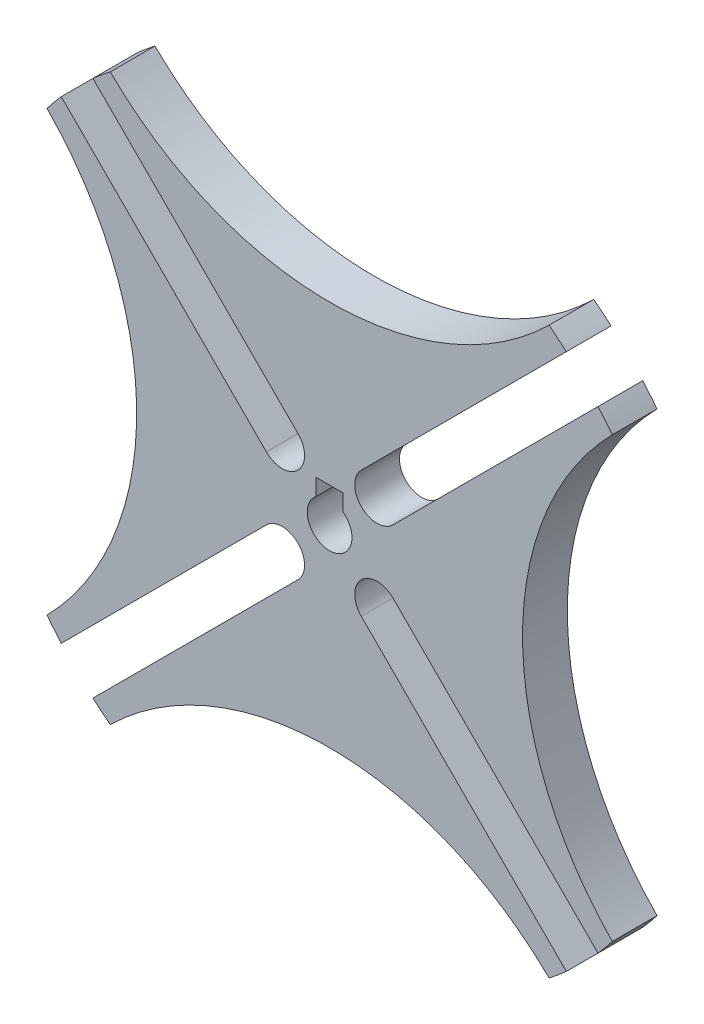
ISO-10303-21;
HEADER;
FILE_DESCRIPTION(('STEP AP214'),'2;1');
FILE_NAME('part.step','',(''),(''),'','','');
FILE_SCHEMA(('AUTOMOTIVE_DESIGN { 1 0 10303 214 1 1 1 1 }'));
ENDSEC;
DATA;
#1=APPLICATION_CONTEXT('core data for automotive mechanical design processes');
#2=APPLICATION_PROTOCOL_DEFINITION('international standard','automotive_design',2000,#1);
#3=PRODUCT_CONTEXT('',#1,'mechanical');
#4=PRODUCT('Part','Part','',(#3));
#5=PRODUCT_RELATED_PRODUCT_CATEGORY('part','',(#4));
#6=PRODUCT_DEFINITION_FORMATION('','',#4);
#7=PRODUCT_DEFINITION_CONTEXT('part definition',#1,'design');
#8=PRODUCT_DEFINITION('design','',#6,#7);
#9=PRODUCT_DEFINITION_SHAPE('','',#8);
#10=(LENGTH_UNIT() NAMED_UNIT(*) SI_UNIT(.MILLI.,.METRE.));
#11=(NAMED_UNIT(*) PLANE_ANGLE_UNIT() SI_UNIT($,.RADIAN.));
#12=(NAMED_UNIT(*) SI_UNIT($,.STERADIAN.) SOLID_ANGLE_UNIT());
#13=UNCERTAINTY_MEASURE_WITH_UNIT(LENGTH_MEASURE(1.E-05),#10,'distance_accuracy_value','');
#14=(GEOMETRIC_REPRESENTATION_CONTEXT(3) GLOBAL_UNCERTAINTY_ASSIGNED_CONTEXT((#13)) GLOBAL_UNIT_ASSIGNED_CONTEXT((#10,
#11,#12)) REPRESENTATION_CONTEXT('',''));
#15=CARTESIAN_POINT('',(0.,0.,0.));
#16=DIRECTION('',(0.,0.,1.));
#17=DIRECTION('',(1.,0.,0.));
#18=AXIS2_PLACEMENT_3D('',#15,#16,#17);
#19=CARTESIAN_POINT('',(-3.51343681902071,3.51343681902079,5.1675));
#20=DIRECTION('',(-0.707106781186549,0.707106781186546,0.));
#21=DIRECTION('',(-0.707106781186546,-0.707106781186549,0.));
#22=AXIS2_PLACEMENT_3D('',#19,#20,#21);
#23=PLANE('',#22);
#24=DIRECTION('',(0.707106781186546,0.707106781186549,0.));
#25=VECTOR('',#24,1.);
#26=CARTESIAN_POINT('',(-3.51343681902071,3.51343681902079,-4.77));
#27=LINE('',#26,#25);
#28=CARTESIAN_POINT('',(7.02687363804124,14.0537472760828,-4.77));
#29=VERTEX_POINT('',#28);
#30=CARTESIAN_POINT('',(52.5916499532029,59.6185235912445,-4.77));
#31=VERTEX_POINT('',#30);
#32=EDGE_CURVE('E260',#29,#31,#27,.T.);
#33=ORIENTED_EDGE('',*,*,#32,.T.);
#34=DIRECTION('',(0.,0.,-1.));
#35=VECTOR('',#34,1.);
#36=CARTESIAN_POINT('',(52.5916499532029,59.6185235912445,5.1675));
#37=LINE('',#36,#35);
#38=CARTESIAN_POINT('',(52.5916499532029,59.6185235912445,5.1675));
#39=VERTEX_POINT('',#38);
#40=EDGE_CURVE('E415',#39,#31,#37,.T.);
#41=ORIENTED_EDGE('',*,*,#40,.F.);
#42=DIRECTION('',(0.707106781186546,0.707106781186549,0.));
#43=VECTOR('',#42,1.);
#44=CARTESIAN_POINT('',(-3.51343681902071,3.51343681902079,5.1675));
#45=LINE('',#44,#43);
#46=CARTESIAN_POINT('',(7.02687363804124,14.0537472760828,5.1675));
#47=VERTEX_POINT('',#46);
#48=EDGE_CURVE('E462',#47,#39,#45,.T.);
#49=ORIENTED_EDGE('',*,*,#48,.F.);
#50=DIRECTION('',(0.,0.,-1.));
#51=VECTOR('',#50,1.);
#52=CARTESIAN_POINT('',(7.02687363804124,14.0537472760828,5.1675));
#53=LINE('',#52,#51);
#54=EDGE_CURVE('E69',#47,#29,#53,.T.);
#55=ORIENTED_EDGE('',*,*,#54,.T.);
#56=EDGE_LOOP('',(#33,#41,#49,#55));
#57=FACE_BOUND('',#56,.T.);
#58=ADVANCED_FACE('F44',(#57),#23,.F.);
#59=CARTESIAN_POINT('',(0.,1.34533611397234E-13,5.1675));
#60=DIRECTION('',(0.,0.,-1.));
#61=DIRECTION('',(-1.,0.,0.));
#62=AXIS2_PLACEMENT_3D('',#59,#60,#61);
#63=CYLINDRICAL_SURFACE('',#62,79.5);
#64=CARTESIAN_POINT('',(0.,1.34533611397234E-13,-4.77));
#65=DIRECTION('',(0.,0.,1.));
#66=DIRECTION('',(1.,0.,0.));
#67=AXIS2_PLACEMENT_3D('',#64,#65,#66);
#68=CIRCLE('',#67,79.5);
#69=CARTESIAN_POINT('',(48.7449791303425,62.8026831399939,-4.77));
#70=VERTEX_POINT('',#69);
#71=EDGE_CURVE('E264',#31,#70,#68,.T.);
#72=ORIENTED_EDGE('',*,*,#71,.T.);
#73=DIRECTION('',(0.,0.,-1.));
#74=VECTOR('',#73,1.);
#75=CARTESIAN_POINT('',(48.7449791303425,62.8026831399939,5.1675));
#76=LINE('',#75,#74);
#77=CARTESIAN_POINT('',(48.7449791303425,62.8026831399939,5.1675));
#78=VERTEX_POINT('',#77);
#79=EDGE_CURVE('E412',#78,#70,#76,.T.);
#80=ORIENTED_EDGE('',*,*,#79,.F.);
#81=CARTESIAN_POINT('',(0.,1.34533611397234E-13,5.1675));
#82=DIRECTION('',(0.,0.,1.));
#83=DIRECTION('',(1.,0.,0.));
#84=AXIS2_PLACEMENT_3D('',#81,#82,#83);
#85=CIRCLE('',#84,79.5);
#86=EDGE_CURVE('E157',#39,#78,#85,.T.);
#87=ORIENTED_EDGE('',*,*,#86,.F.);
#88=ORIENTED_EDGE('',*,*,#40,.T.);
#89=EDGE_LOOP('',(#72,#80,#87,#88));
#90=FACE_BOUND('',#89,.T.);
#91=ADVANCED_FACE('F538',(#90),#63,.T.);
#92=CARTESIAN_POINT('',(1.12993347839726E-12,112.429978208661,5.1675));
#93=DIRECTION('',(0.,0.,-1.));
#94=DIRECTION('',(-1.,0.,0.));
#95=AXIS2_PLACEMENT_3D('',#92,#93,#94);
#96=CYLINDRICAL_SURFACE('',#95,69.5625);
#97=CARTESIAN_POINT('',(1.12993347839726E-12,112.429978208661,-4.77));
#98=DIRECTION('',(0.,0.,1.));
#99=DIRECTION('',(1.,0.,0.));
#100=AXIS2_PLACEMENT_3D('',#97,#98,#99);
#101=CIRCLE('',#100,69.5625);
#102=CARTESIAN_POINT('',(-48.7449791303413,62.802683139995,-4.77));
#103=VERTEX_POINT('',#102);
#104=EDGE_CURVE('E268',#103,#70,#101,.T.);
#105=ORIENTED_EDGE('',*,*,#104,.F.);
#106=DIRECTION('',(0.,0.,-1.));
#107=VECTOR('',#106,1.);
#108=CARTESIAN_POINT('',(-48.7449791303413,62.802683139995,5.1675));
#109=LINE('',#108,#107);
#110=CARTESIAN_POINT('',(-48.7449791303413,62.802683139995,5.1675));
#111=VERTEX_POINT('',#110);
#112=EDGE_CURVE('E409',#111,#103,#109,.T.);
#113=ORIENTED_EDGE('',*,*,#112,.F.);
#114=CARTESIAN_POINT('',(1.12993347839726E-12,112.429978208661,5.1675));
#115=DIRECTION('',(0.,0.,1.));
#116=DIRECTION('',(1.,0.,0.));
#117=AXIS2_PLACEMENT_3D('',#114,#115,#116);
#118=CIRCLE('',#117,69.5625);
#119=EDGE_CURVE('E467',#111,#78,#118,.T.);
#120=ORIENTED_EDGE('',*,*,#119,.T.);
#121=ORIENTED_EDGE('',*,*,#79,.T.);
#122=EDGE_LOOP('',(#105,#113,#120,#121));
#123=FACE_BOUND('',#122,.T.);
#124=ADVANCED_FACE('F542',(#123),#96,.F.);
#125=CARTESIAN_POINT('',(0.,1.34533611397234E-13,5.1675));
#126=DIRECTION('',(0.,0.,-1.));
#127=DIRECTION('',(-1.,0.,0.));
#128=AXIS2_PLACEMENT_3D('',#125,#126,#127);
#129=CYLINDRICAL_SURFACE('',#128,79.5);
#130=CARTESIAN_POINT('',(0.,1.34533611397234E-13,-4.77));
#131=DIRECTION('',(0.,0.,1.));
#132=DIRECTION('',(1.,0.,0.));
#133=AXIS2_PLACEMENT_3D('',#130,#131,#132);
#134=CIRCLE('',#133,79.5);
#135=CARTESIAN_POINT('',(-52.5916499532025,59.6185235912449,-4.77));
#136=VERTEX_POINT('',#135);
#137=EDGE_CURVE('E272',#103,#136,#134,.T.);
#138=ORIENTED_EDGE('',*,*,#137,.T.);
#139=DIRECTION('',(0.,0.,-1.));
#140=VECTOR('',#139,1.);
#141=CARTESIAN_POINT('',(-52.5916499532025,59.6185235912449,5.1675));
#142=LINE('',#141,#140);
#143=CARTESIAN_POINT('',(-52.5916499532025,59.6185235912449,5.1675));
#144=VERTEX_POINT('',#143);
#145=EDGE_CURVE('E406',#144,#136,#142,.T.);
#146=ORIENTED_EDGE('',*,*,#145,.F.);
#147=CARTESIAN_POINT('',(0.,1.34533611397234E-13,5.1675));
#148=DIRECTION('',(0.,0.,1.));
#149=DIRECTION('',(1.,0.,0.));
#150=AXIS2_PLACEMENT_3D('',#147,#148,#149);
#151=CIRCLE('',#150,79.5);
#152=EDGE_CURVE('E471',#111,#144,#151,.T.);
#153=ORIENTED_EDGE('',*,*,#152,.F.);
#154=ORIENTED_EDGE('',*,*,#112,.T.);
#155=EDGE_LOOP('',(#138,#146,#153,#154));
#156=FACE_BOUND('',#155,.T.);
#157=ADVANCED_FACE('F548',(#156),#129,.T.);
#158=CARTESIAN_POINT('',(3.51343681902064,3.51343681902076,5.1675));
#159=DIRECTION('',(-0.707106781186554,-0.707106781186541,0.));
#160=DIRECTION('',(0.707106781186541,-0.707106781186554,0.));
#161=AXIS2_PLACEMENT_3D('',#158,#159,#160);
#162=PLANE('',#161);
#163=DIRECTION('',(-0.707106781186541,0.707106781186554,0.));
#164=VECTOR('',#163,1.);
#165=CARTESIAN_POINT('',(3.51343681902064,3.51343681902076,-4.77));
#166=LINE('',#165,#164);
#167=CARTESIAN_POINT('',(-7.02687363804124,14.0537472760828,-4.77));
#168=VERTEX_POINT('',#167);
#169=EDGE_CURVE('E276',#168,#136,#166,.T.);
#170=ORIENTED_EDGE('',*,*,#169,.F.);
#171=DIRECTION('',(0.,0.,-1.));
#172=VECTOR('',#171,1.);
#173=CARTESIAN_POINT('',(-7.02687363804124,14.0537472760828,5.1675));
#174=LINE('',#173,#172);
#175=CARTESIAN_POINT('',(-7.02687363804124,14.0537472760828,5.1675));
#176=VERTEX_POINT('',#175);
#177=EDGE_CURVE('E403',#176,#168,#174,.T.);
#178=ORIENTED_EDGE('',*,*,#177,.F.);
#179=DIRECTION('',(-0.707106781186541,0.707106781186554,0.));
#180=VECTOR('',#179,1.);
#181=CARTESIAN_POINT('',(3.51343681902064,3.51343681902076,5.1675));
#182=LINE('',#181,#180);
#183=EDGE_CURVE('E474',#176,#144,#182,.T.);
#184=ORIENTED_EDGE('',*,*,#183,.T.);
#185=ORIENTED_EDGE('',*,*,#145,.T.);
#186=EDGE_LOOP('',(#170,#178,#184,#185));
#187=FACE_BOUND('',#186,.T.);
#188=ADVANCED_FACE('F551',(#187),#162,.T.);
#189=CARTESIAN_POINT('',(-10.5403104570619,10.5403104570622,5.1675));
#190=DIRECTION('',(0.,0.,-1.));
#191=DIRECTION('',(-1.,0.,0.));
#192=AXIS2_PLACEMENT_3D('',#189,#190,#191);
#193=CYLINDRICAL_SURFACE('',#192,4.96875);
#194=CARTESIAN_POINT('',(-10.5403104570619,10.5403104570622,-4.77));
#195=DIRECTION('',(0.,0.,1.));
#196=DIRECTION('',(1.,0.,0.));
#197=AXIS2_PLACEMENT_3D('',#194,#195,#196);
#198=CIRCLE('',#197,4.96875);
#199=CARTESIAN_POINT('',(-14.0537472760826,7.02687363804157,-4.77));
#200=VERTEX_POINT('',#199);
#201=EDGE_CURVE('E280',#200,#168,#198,.T.);
#202=ORIENTED_EDGE('',*,*,#201,.F.);
#203=DIRECTION('',(0.,0.,-1.));
#204=VECTOR('',#203,1.);
#205=CARTESIAN_POINT('',(-14.0537472760826,7.02687363804157,5.1675));
#206=LINE('',#205,#204);
#207=CARTESIAN_POINT('',(-14.0537472760826,7.02687363804157,5.1675));
#208=VERTEX_POINT('',#207);
#209=EDGE_CURVE('E400',#208,#200,#206,.T.);
#210=ORIENTED_EDGE('',*,*,#209,.F.);
#211=CARTESIAN_POINT('',(-10.5403104570619,10.5403104570622,5.1675));
#212=DIRECTION('',(0.,0.,1.));
#213=DIRECTION('',(1.,0.,0.));
#214=AXIS2_PLACEMENT_3D('',#211,#212,#213);
#215=CIRCLE('',#214,4.96875);
#216=EDGE_CURVE('E478',#208,#176,#215,.T.);
#217=ORIENTED_EDGE('',*,*,#216,.T.);
#218=ORIENTED_EDGE('',*,*,#177,.T.);
#219=EDGE_LOOP('',(#202,#210,#217,#218));
#220=FACE_BOUND('',#219,.T.);
#221=ADVANCED_FACE('F554',(#220),#193,.F.);
#222=CARTESIAN_POINT('',(-3.51343681902055,-3.5134368190204,5.1675));
#223=DIRECTION('',(-0.707106781186544,-0.707106781186551,0.));
#224=DIRECTION('',(0.707106781186551,-0.707106781186544,0.));
#225=AXIS2_PLACEMENT_3D('',#222,#223,#224);
#226=PLANE('',#225);
#227=DIRECTION('',(-0.707106781186551,0.707106781186544,0.));
#228=VECTOR('',#227,1.);
#229=CARTESIAN_POINT('',(-3.51343681902055,-3.5134368190204,-4.77));
#230=LINE('',#229,#228);
#231=CARTESIAN_POINT('',(-59.6185235912445,52.591649953203,-4.77));
#232=VERTEX_POINT('',#231);
#233=EDGE_CURVE('E284',#200,#232,#230,.T.);
#234=ORIENTED_EDGE('',*,*,#233,.T.);
#235=DIRECTION('',(0.,0.,-1.));
#236=VECTOR('',#235,1.);
#237=CARTESIAN_POINT('',(-59.6185235912445,52.591649953203,5.1675));
#238=LINE('',#237,#236);
#239=CARTESIAN_POINT('',(-59.6185235912445,52.591649953203,5.1675));
#240=VERTEX_POINT('',#239);
#241=EDGE_CURVE('E396',#240,#232,#238,.T.);
#242=ORIENTED_EDGE('',*,*,#241,.F.);
#243=DIRECTION('',(-0.707106781186551,0.707106781186544,0.));
#244=VECTOR('',#243,1.);
#245=CARTESIAN_POINT('',(-3.51343681902055,-3.5134368190204,5.1675));
#246=LINE('',#245,#244);
#247=EDGE_CURVE('E482',#208,#240,#246,.T.);
#248=ORIENTED_EDGE('',*,*,#247,.F.);
#249=ORIENTED_EDGE('',*,*,#209,.T.);
#250=EDGE_LOOP('',(#234,#242,#248,#249));
#251=FACE_BOUND('',#250,.T.);
#252=ADVANCED_FACE('F561',(#251),#226,.F.);
#253=CARTESIAN_POINT('',(0.,1.34533611397234E-13,5.1675));
#254=DIRECTION('',(0.,0.,-1.));
#255=DIRECTION('',(-1.,0.,0.));
#256=AXIS2_PLACEMENT_3D('',#253,#254,#255);
#257=CYLINDRICAL_SURFACE('',#256,79.5);
#258=CARTESIAN_POINT('',(0.,1.34533611397234E-13,-4.77));
#259=DIRECTION('',(0.,0.,1.));
#260=DIRECTION('',(1.,0.,0.));
#261=AXIS2_PLACEMENT_3D('',#258,#259,#260);
#262=CIRCLE('',#261,79.5);
#263=CARTESIAN_POINT('',(-62.8026831399938,48.7449791303427,-4.77));
#264=VERTEX_POINT('',#263);
#265=EDGE_CURVE('E287',#232,#264,#262,.T.);
#266=ORIENTED_EDGE('',*,*,#265,.T.);
#267=DIRECTION('',(0.,0.,-1.));
#268=VECTOR('',#267,1.);
#269=CARTESIAN_POINT('',(-62.8026831399938,48.7449791303427,5.1675));
#270=LINE('',#269,#268);
#271=CARTESIAN_POINT('',(-62.8026831399938,48.7449791303427,5.1675));
#272=VERTEX_POINT('',#271);
#273=EDGE_CURVE('E393',#272,#264,#270,.T.);
#274=ORIENTED_EDGE('',*,*,#273,.F.);
#275=CARTESIAN_POINT('',(0.,1.34533611397234E-13,5.1675));
#276=DIRECTION('',(0.,0.,1.));
#277=DIRECTION('',(1.,0.,0.));
#278=AXIS2_PLACEMENT_3D('',#275,#276,#277);
#279=CIRCLE('',#278,79.5);
#280=EDGE_CURVE('E485',#240,#272,#279,.T.);
#281=ORIENTED_EDGE('',*,*,#280,.F.);
#282=ORIENTED_EDGE('',*,*,#241,.T.);
#283=EDGE_LOOP('',(#266,#274,#281,#282));
#284=FACE_BOUND('',#283,.T.);
#285=ADVANCED_FACE('F565',(#284),#257,.T.);
#286=CARTESIAN_POINT('',(-112.429978208661,9.19627953081396E-13,5.1675));
#287=DIRECTION('',(0.,0.,-1.));
#288=DIRECTION('',(-1.,0.,0.));
#289=AXIS2_PLACEMENT_3D('',#286,#287,#288);
#290=CYLINDRICAL_SURFACE('',#289,69.5625000000003);
#291=CARTESIAN_POINT('',(-112.429978208661,9.19627953081396E-13,-4.77));
#292=DIRECTION('',(0.,0.,1.));
#293=DIRECTION('',(1.,0.,0.));
#294=AXIS2_PLACEMENT_3D('',#291,#292,#293);
#295=CIRCLE('',#294,69.5625000000003);
#296=CARTESIAN_POINT('',(-62.8026831399946,-48.7449791303416,-4.77));
#297=VERTEX_POINT('',#296);
#298=EDGE_CURVE('E291',#297,#264,#295,.T.);
#299=ORIENTED_EDGE('',*,*,#298,.F.);
#300=DIRECTION('',(0.,0.,-1.));
#301=VECTOR('',#300,1.);
#302=CARTESIAN_POINT('',(-62.8026831399946,-48.7449791303416,5.1675));
#303=LINE('',#302,#301);
#304=CARTESIAN_POINT('',(-62.8026831399946,-48.7449791303416,5.1675));
#305=VERTEX_POINT('',#304);
#306=EDGE_CURVE('E390',#305,#297,#303,.T.);
#307=ORIENTED_EDGE('',*,*,#306,.F.);
#308=CARTESIAN_POINT('',(-112.429978208661,9.19627953081396E-13,5.1675));
#309=DIRECTION('',(0.,0.,1.));
#310=DIRECTION('',(1.,0.,0.));
#311=AXIS2_PLACEMENT_3D('',#308,#309,#310);
#312=CIRCLE('',#311,69.5625000000003);
#313=EDGE_CURVE('E488',#305,#272,#312,.T.);
#314=ORIENTED_EDGE('',*,*,#313,.T.);
#315=ORIENTED_EDGE('',*,*,#273,.T.);
#316=EDGE_LOOP('',(#299,#307,#314,#315));
#317=FACE_BOUND('',#316,.T.);
#318=ADVANCED_FACE('F568',(#317),#290,.F.);
#319=CARTESIAN_POINT('',(0.,1.34533611397234E-13,5.1675));
#320=DIRECTION('',(0.,0.,-1.));
#321=DIRECTION('',(-1.,0.,0.));
#322=AXIS2_PLACEMENT_3D('',#319,#320,#321);
#323=CYLINDRICAL_SURFACE('',#322,79.5);
#324=CARTESIAN_POINT('',(0.,1.34533611397234E-13,-4.77));
#325=DIRECTION('',(0.,0.,1.));
#326=DIRECTION('',(1.,0.,0.));
#327=AXIS2_PLACEMENT_3D('',#324,#325,#326);
#328=CIRCLE('',#327,79.5);
#329=CARTESIAN_POINT('',(-59.6185235912446,-52.5916499532026,-4.77));
#330=VERTEX_POINT('',#329);
#331=EDGE_CURVE('E295',#297,#330,#328,.T.);
#332=ORIENTED_EDGE('',*,*,#331,.T.);
#333=DIRECTION('',(0.,0.,-1.));
#334=VECTOR('',#333,1.);
#335=CARTESIAN_POINT('',(-59.6185235912446,-52.5916499532026,5.1675));
#336=LINE('',#335,#334);
#337=CARTESIAN_POINT('',(-59.6185235912446,-52.5916499532026,5.1675));
#338=VERTEX_POINT('',#337);
#339=EDGE_CURVE('E387',#338,#330,#336,.T.);
#340=ORIENTED_EDGE('',*,*,#339,.F.);
#341=CARTESIAN_POINT('',(0.,1.34533611397234E-13,5.1675));
#342=DIRECTION('',(0.,0.,1.));
#343=DIRECTION('',(1.,0.,0.));
#344=AXIS2_PLACEMENT_3D('',#341,#342,#343);
#345=CIRCLE('',#344,79.5);
#346=EDGE_CURVE('E492',#305,#338,#345,.T.);
#347=ORIENTED_EDGE('',*,*,#346,.F.);
#348=ORIENTED_EDGE('',*,*,#306,.T.);
#349=EDGE_LOOP('',(#332,#340,#347,#348));
#350=FACE_BOUND('',#349,.T.);
#351=ADVANCED_FACE('F574',(#350),#323,.T.);
#352=CARTESIAN_POINT('',(-3.51343681902068,3.51343681902081,5.1675));
#353=DIRECTION('',(0.707106781186544,-0.707106781186551,0.));
#354=DIRECTION('',(0.707106781186551,0.707106781186544,0.));
#355=AXIS2_PLACEMENT_3D('',#352,#353,#354);
#356=PLANE('',#355);
#357=DIRECTION('',(-0.707106781186551,-0.707106781186544,0.));
#358=VECTOR('',#357,1.);
#359=CARTESIAN_POINT('',(-3.51343681902068,3.51343681902081,-4.77));
#360=LINE('',#359,#358);
#361=CARTESIAN_POINT('',(-14.0537472760827,-7.02687363804111,-4.77));
#362=VERTEX_POINT('',#361);
#363=EDGE_CURVE('E299',#362,#330,#360,.T.);
#364=ORIENTED_EDGE('',*,*,#363,.F.);
#365=DIRECTION('',(0.,0.,-1.));
#366=VECTOR('',#365,1.);
#367=CARTESIAN_POINT('',(-14.0537472760827,-7.02687363804111,5.1675));
#368=LINE('',#367,#366);
#369=CARTESIAN_POINT('',(-14.0537472760827,-7.02687363804111,5.1675));
#370=VERTEX_POINT('',#369);
#371=EDGE_CURVE('E384',#370,#362,#368,.T.);
#372=ORIENTED_EDGE('',*,*,#371,.F.);
#373=DIRECTION('',(-0.707106781186551,-0.707106781186544,0.));
#374=VECTOR('',#373,1.);
#375=CARTESIAN_POINT('',(-3.51343681902068,3.51343681902081,5.1675));
#376=LINE('',#375,#374);
#377=EDGE_CURVE('E495',#370,#338,#376,.T.);
#378=ORIENTED_EDGE('',*,*,#377,.T.);
#379=ORIENTED_EDGE('',*,*,#339,.T.);
#380=EDGE_LOOP('',(#364,#372,#378,#379));
#381=FACE_BOUND('',#380,.T.);
#382=ADVANCED_FACE('F578',(#381),#356,.T.);
#383=CARTESIAN_POINT('',(-10.5403104570621,-10.5403104570618,5.1675));
#384=DIRECTION('',(0.,0.,-1.));
#385=DIRECTION('',(-1.,0.,0.));
#386=AXIS2_PLACEMENT_3D('',#383,#384,#385);
#387=CYLINDRICAL_SURFACE('',#386,4.96875);
#388=CARTESIAN_POINT('',(-10.5403104570621,-10.5403104570618,-4.77));
#389=DIRECTION('',(0.,0.,1.));
#390=DIRECTION('',(1.,0.,0.));
#391=AXIS2_PLACEMENT_3D('',#388,#389,#390);
#392=CIRCLE('',#391,4.96875);
#393=CARTESIAN_POINT('',(-7.02687363804143,-14.0537472760825,-4.77));
#394=VERTEX_POINT('',#393);
#395=EDGE_CURVE('E303',#394,#362,#392,.T.);
#396=ORIENTED_EDGE('',*,*,#395,.F.);
#397=DIRECTION('',(0.,0.,-1.));
#398=VECTOR('',#397,1.);
#399=CARTESIAN_POINT('',(-7.02687363804143,-14.0537472760825,5.1675));
#400=LINE('',#399,#398);
#401=CARTESIAN_POINT('',(-7.02687363804143,-14.0537472760825,5.1675));
#402=VERTEX_POINT('',#401);
#403=EDGE_CURVE('E381',#402,#394,#400,.T.);
#404=ORIENTED_EDGE('',*,*,#403,.F.);
#405=CARTESIAN_POINT('',(-10.5403104570621,-10.5403104570618,5.1675));
#406=DIRECTION('',(0.,0.,1.));
#407=DIRECTION('',(1.,0.,0.));
#408=AXIS2_PLACEMENT_3D('',#405,#406,#407);
#409=CIRCLE('',#408,4.96875);
#410=EDGE_CURVE('E499',#402,#370,#409,.T.);
#411=ORIENTED_EDGE('',*,*,#410,.T.);
#412=ORIENTED_EDGE('',*,*,#371,.T.);
#413=EDGE_LOOP('',(#396,#404,#411,#412));
#414=FACE_BOUND('',#413,.T.);
#415=ADVANCED_FACE('F581',(#414),#387,.F.);
#416=CARTESIAN_POINT('',(3.51343681902059,-3.51343681902054,5.1675));
#417=DIRECTION('',(0.707106781186544,-0.707106781186551,0.));
#418=DIRECTION('',(0.707106781186551,0.707106781186544,0.));
#419=AXIS2_PLACEMENT_3D('',#416,#417,#418);
#420=PLANE('',#419);
#421=DIRECTION('',(-0.707106781186551,-0.707106781186544,0.));
#422=VECTOR('',#421,1.);
#423=CARTESIAN_POINT('',(3.51343681902059,-3.51343681902054,-4.77));
#424=LINE('',#423,#422);
#425=CARTESIAN_POINT('',(-52.5916499532034,-59.6185235912439,-4.77));
#426=VERTEX_POINT('',#425);
#427=EDGE_CURVE('E307',#394,#426,#424,.T.);
#428=ORIENTED_EDGE('',*,*,#427,.T.);
#429=DIRECTION('',(0.,0.,-1.));
#430=VECTOR('',#429,1.);
#431=CARTESIAN_POINT('',(-52.5916499532034,-59.6185235912439,5.1675));
#432=LINE('',#431,#430);
#433=CARTESIAN_POINT('',(-52.5916499532034,-59.6185235912439,5.1675));
#434=VERTEX_POINT('',#433);
#435=EDGE_CURVE('E377',#434,#426,#432,.T.);
#436=ORIENTED_EDGE('',*,*,#435,.F.);
#437=DIRECTION('',(-0.707106781186551,-0.707106781186544,0.));
#438=VECTOR('',#437,1.);
#439=CARTESIAN_POINT('',(3.51343681902059,-3.51343681902054,5.1675));
#440=LINE('',#439,#438);
#441=EDGE_CURVE('E503',#402,#434,#440,.T.);
#442=ORIENTED_EDGE('',*,*,#441,.F.);
#443=ORIENTED_EDGE('',*,*,#403,.T.);
#444=EDGE_LOOP('',(#428,#436,#442,#443));
#445=FACE_BOUND('',#444,.T.);
#446=ADVANCED_FACE('F588',(#445),#420,.F.);
#447=CARTESIAN_POINT('',(0.,1.34533611397234E-13,5.1675));
#448=DIRECTION('',(0.,0.,-1.));
#449=DIRECTION('',(-1.,0.,0.));
#450=AXIS2_PLACEMENT_3D('',#447,#448,#449);
#451=CYLINDRICAL_SURFACE('',#450,79.5);
#452=CARTESIAN_POINT('',(0.,1.34533611397234E-13,-4.77));
#453=DIRECTION('',(0.,0.,1.));
#454=DIRECTION('',(1.,0.,0.));
#455=AXIS2_PLACEMENT_3D('',#452,#453,#454);
#456=CIRCLE('',#455,79.5);
#457=CARTESIAN_POINT('',(-48.7449791303424,-62.8026831399939,-4.77));
#458=VERTEX_POINT('',#457);
#459=EDGE_CURVE('E310',#426,#458,#456,.T.);
#460=ORIENTED_EDGE('',*,*,#459,.T.);
#461=DIRECTION('',(0.,0.,-1.));
#462=VECTOR('',#461,1.);
#463=CARTESIAN_POINT('',(-48.7449791303424,-62.8026831399939,5.1675));
#464=LINE('',#463,#462);
#465=CARTESIAN_POINT('',(-48.7449791303424,-62.8026831399939,5.1675));
#466=VERTEX_POINT('',#465);
#467=EDGE_CURVE('E374',#466,#458,#464,.T.);
#468=ORIENTED_EDGE('',*,*,#467,.F.);
#469=CARTESIAN_POINT('',(0.,1.34533611397234E-13,5.1675));
#470=DIRECTION('',(0.,0.,1.));
#471=DIRECTION('',(1.,0.,0.));
#472=AXIS2_PLACEMENT_3D('',#469,#470,#471);
#473=CIRCLE('',#472,79.5);
#474=EDGE_CURVE('E506',#434,#466,#473,.T.);
#475=ORIENTED_EDGE('',*,*,#474,.F.);
#476=ORIENTED_EDGE('',*,*,#435,.T.);
#477=EDGE_LOOP('',(#460,#468,#475,#476));
#478=FACE_BOUND('',#477,.T.);
#479=ADVANCED_FACE('F592',(#478),#451,.T.);
#480=CARTESIAN_POINT('',(-4.38998361300706E-13,-112.429978208661,5.1675));
#481=DIRECTION('',(0.,0.,-1.));
#482=DIRECTION('',(-1.,0.,0.));
#483=AXIS2_PLACEMENT_3D('',#480,#481,#482);
#484=CYLINDRICAL_SURFACE('',#483,69.5625000000003);
#485=CARTESIAN_POINT('',(-4.38998361300706E-13,-112.429978208661,-4.77));
#486=DIRECTION('',(0.,0.,1.));
#487=DIRECTION('',(1.,0.,0.));
#488=AXIS2_PLACEMENT_3D('',#485,#486,#487);
#489=CIRCLE('',#488,69.5625000000003);
#490=CARTESIAN_POINT('',(48.7449791303419,-62.8026831399942,-4.77));
#491=VERTEX_POINT('',#490);
#492=EDGE_CURVE('E314',#491,#458,#489,.T.);
#493=ORIENTED_EDGE('',*,*,#492,.F.);
#494=DIRECTION('',(0.,0.,-1.));
#495=VECTOR('',#494,1.);
#496=CARTESIAN_POINT('',(48.7449791303419,-62.8026831399942,5.1675));
#497=LINE('',#496,#495);
#498=CARTESIAN_POINT('',(48.7449791303419,-62.8026831399942,5.1675));
#499=VERTEX_POINT('',#498);
#500=EDGE_CURVE('E371',#499,#491,#497,.T.);
#501=ORIENTED_EDGE('',*,*,#500,.F.);
#502=CARTESIAN_POINT('',(-4.38998361300706E-13,-112.429978208661,5.1675));
#503=DIRECTION('',(0.,0.,1.));
#504=DIRECTION('',(1.,0.,0.));
#505=AXIS2_PLACEMENT_3D('',#502,#503,#504);
#506=CIRCLE('',#505,69.5625000000003);
#507=EDGE_CURVE('E509',#499,#466,#506,.T.);
#508=ORIENTED_EDGE('',*,*,#507,.T.);
#509=ORIENTED_EDGE('',*,*,#467,.T.);
#510=EDGE_LOOP('',(#493,#501,#508,#509));
#511=FACE_BOUND('',#510,.T.);
#512=ADVANCED_FACE('F595',(#511),#484,.F.);
#513=CARTESIAN_POINT('',(0.,1.34533611397234E-13,5.1675));
#514=DIRECTION('',(0.,0.,-1.));
#515=DIRECTION('',(-1.,0.,0.));
#516=AXIS2_PLACEMENT_3D('',#513,#514,#515);
#517=CYLINDRICAL_SURFACE('',#516,79.5);
#518=CARTESIAN_POINT('',(0.,1.34533611397234E-13,-4.77));
#519=DIRECTION('',(0.,0.,1.));
#520=DIRECTION('',(1.,0.,0.));
#521=AXIS2_PLACEMENT_3D('',#518,#519,#520);
#522=CIRCLE('',#521,79.5);
#523=CARTESIAN_POINT('',(52.5916499532029,-59.6185235912443,-4.77));
#524=VERTEX_POINT('',#523);
#525=EDGE_CURVE('E318',#491,#524,#522,.T.);
#526=ORIENTED_EDGE('',*,*,#525,.T.);
#527=DIRECTION('',(0.,0.,-1.));
#528=VECTOR('',#527,1.);
#529=CARTESIAN_POINT('',(52.5916499532029,-59.6185235912443,5.1675));
#530=LINE('',#529,#528);
#531=CARTESIAN_POINT('',(52.5916499532029,-59.6185235912443,5.1675));
#532=VERTEX_POINT('',#531);
#533=EDGE_CURVE('E368',#532,#524,#530,.T.);
#534=ORIENTED_EDGE('',*,*,#533,.F.);
#535=CARTESIAN_POINT('',(0.,1.34533611397234E-13,5.1675));
#536=DIRECTION('',(0.,0.,1.));
#537=DIRECTION('',(1.,0.,0.));
#538=AXIS2_PLACEMENT_3D('',#535,#536,#537);
#539=CIRCLE('',#538,79.5);
#540=EDGE_CURVE('E513',#499,#532,#539,.T.);
#541=ORIENTED_EDGE('',*,*,#540,.F.);
#542=ORIENTED_EDGE('',*,*,#500,.T.);
#543=EDGE_LOOP('',(#526,#534,#541,#542));
#544=FACE_BOUND('',#543,.T.);
#545=ADVANCED_FACE('F601',(#544),#517,.T.);
#546=CARTESIAN_POINT('',(-3.51343681902071,-3.51343681902051,5.1675));
#547=DIRECTION('',(0.707106781186549,0.707106781186546,0.));
#548=DIRECTION('',(-0.707106781186546,0.707106781186549,0.));
#549=AXIS2_PLACEMENT_3D('',#546,#547,#548);
#550=PLANE('',#549);
#551=DIRECTION('',(0.707106781186546,-0.707106781186549,0.));
#552=VECTOR('',#551,1.);
#553=CARTESIAN_POINT('',(-3.51343681902071,-3.51343681902051,-4.77));
#554=LINE('',#553,#552);
#555=CARTESIAN_POINT('',(7.02687363804125,-14.0537472760825,-4.77));
#556=VERTEX_POINT('',#555);
#557=EDGE_CURVE('E322',#556,#524,#554,.T.);
#558=ORIENTED_EDGE('',*,*,#557,.F.);
#559=DIRECTION('',(0.,0.,-1.));
#560=VECTOR('',#559,1.);
#561=CARTESIAN_POINT('',(7.02687363804125,-14.0537472760825,5.1675));
#562=LINE('',#561,#560);
#563=CARTESIAN_POINT('',(7.02687363804125,-14.0537472760825,5.1675));
#564=VERTEX_POINT('',#563);
#565=EDGE_CURVE('E365',#564,#556,#562,.T.);
#566=ORIENTED_EDGE('',*,*,#565,.F.);
#567=DIRECTION('',(0.707106781186546,-0.707106781186549,0.));
#568=VECTOR('',#567,1.);
#569=CARTESIAN_POINT('',(-3.51343681902071,-3.51343681902051,5.1675));
#570=LINE('',#569,#568);
#571=EDGE_CURVE('E516',#564,#532,#570,.T.);
#572=ORIENTED_EDGE('',*,*,#571,.T.);
#573=ORIENTED_EDGE('',*,*,#533,.T.);
#574=EDGE_LOOP('',(#558,#566,#572,#573));
#575=FACE_BOUND('',#574,.T.);
#576=ADVANCED_FACE('F605',(#575),#550,.T.);
#577=CARTESIAN_POINT('',(10.5403104570619,-10.5403104570619,5.1675));
#578=DIRECTION('',(0.,0.,-1.));
#579=DIRECTION('',(-1.,0.,0.));
#580=AXIS2_PLACEMENT_3D('',#577,#578,#579);
#581=CYLINDRICAL_SURFACE('',#580,4.96875);
#582=CARTESIAN_POINT('',(10.5403104570619,-10.5403104570619,-4.77));
#583=DIRECTION('',(0.,0.,1.));
#584=DIRECTION('',(1.,0.,0.));
#585=AXIS2_PLACEMENT_3D('',#582,#583,#584);
#586=CIRCLE('',#585,4.96875);
#587=CARTESIAN_POINT('',(14.0537472760826,-7.0268736380412,-4.77));
#588=VERTEX_POINT('',#587);
#589=EDGE_CURVE('E326',#588,#556,#586,.T.);
#590=ORIENTED_EDGE('',*,*,#589,.F.);
#591=DIRECTION('',(0.,0.,-1.));
#592=VECTOR('',#591,1.);
#593=CARTESIAN_POINT('',(14.0537472760826,-7.0268736380412,5.1675));
#594=LINE('',#593,#592);
#595=CARTESIAN_POINT('',(14.0537472760826,-7.0268736380412,5.1675));
#596=VERTEX_POINT('',#595);
#597=EDGE_CURVE('E362',#596,#588,#594,.T.);
#598=ORIENTED_EDGE('',*,*,#597,.F.);
#599=CARTESIAN_POINT('',(10.5403104570619,-10.5403104570619,5.1675));
#600=DIRECTION('',(0.,0.,1.));
#601=DIRECTION('',(1.,0.,0.));
#602=AXIS2_PLACEMENT_3D('',#599,#600,#601);
#603=CIRCLE('',#602,4.96875);
#604=EDGE_CURVE('E520',#596,#564,#603,.T.);
#605=ORIENTED_EDGE('',*,*,#604,.T.);
#606=ORIENTED_EDGE('',*,*,#565,.T.);
#607=EDGE_LOOP('',(#590,#598,#605,#606));
#608=FACE_BOUND('',#607,.T.);
#609=ADVANCED_FACE('F608',(#608),#581,.F.);
#610=CARTESIAN_POINT('',(3.51343681902062,3.51343681902079,5.1675));
#611=DIRECTION('',(0.707106781186549,0.707106781186546,0.));
#612=DIRECTION('',(-0.707106781186546,0.707106781186549,0.));
#613=AXIS2_PLACEMENT_3D('',#610,#611,#612);
#614=PLANE('',#613);
#615=DIRECTION('',(0.707106781186546,-0.707106781186549,0.));
#616=VECTOR('',#615,1.);
#617=CARTESIAN_POINT('',(3.51343681902062,3.51343681902079,-4.77));
#618=LINE('',#617,#616);
#619=CARTESIAN_POINT('',(59.6185235912442,-52.591649953203,-4.77));
#620=VERTEX_POINT('',#619);
#621=EDGE_CURVE('E330',#588,#620,#618,.T.);
#622=ORIENTED_EDGE('',*,*,#621,.T.);
#623=DIRECTION('',(0.,0.,-1.));
#624=VECTOR('',#623,1.);
#625=CARTESIAN_POINT('',(59.6185235912442,-52.591649953203,5.1675));
#626=LINE('',#625,#624);
#627=CARTESIAN_POINT('',(59.6185235912442,-52.591649953203,5.1675));
#628=VERTEX_POINT('',#627);
#629=EDGE_CURVE('E358',#628,#620,#626,.T.);
#630=ORIENTED_EDGE('',*,*,#629,.F.);
#631=DIRECTION('',(0.707106781186546,-0.707106781186549,0.));
#632=VECTOR('',#631,1.);
#633=CARTESIAN_POINT('',(3.51343681902062,3.51343681902079,5.1675));
#634=LINE('',#633,#632);
#635=EDGE_CURVE('E524',#596,#628,#634,.T.);
#636=ORIENTED_EDGE('',*,*,#635,.F.);
#637=ORIENTED_EDGE('',*,*,#597,.T.);
#638=EDGE_LOOP('',(#622,#630,#636,#637));
#639=FACE_BOUND('',#638,.T.);
#640=ADVANCED_FACE('F612',(#639),#614,.F.);
#641=CARTESIAN_POINT('',(0.,1.34533611397234E-13,5.1675));
#642=DIRECTION('',(0.,0.,-1.));
#643=DIRECTION('',(-1.,0.,0.));
#644=AXIS2_PLACEMENT_3D('',#641,#642,#643);
#645=CYLINDRICAL_SURFACE('',#644,79.5);
#646=CARTESIAN_POINT('',(0.,1.34533611397234E-13,-4.77));
#647=DIRECTION('',(0.,0.,1.));
#648=DIRECTION('',(1.,0.,0.));
#649=AXIS2_PLACEMENT_3D('',#646,#647,#648);
#650=CIRCLE('',#649,79.5);
#651=CARTESIAN_POINT('',(62.8026831399941,-48.744979130342,-4.77));
#652=VERTEX_POINT('',#651);
#653=EDGE_CURVE('E333',#620,#652,#650,.T.);
#654=ORIENTED_EDGE('',*,*,#653,.T.);
#655=DIRECTION('',(0.,0.,-1.));
#656=VECTOR('',#655,1.);
#657=CARTESIAN_POINT('',(62.8026831399941,-48.744979130342,5.1675));
#658=LINE('',#657,#656);
#659=CARTESIAN_POINT('',(62.8026831399941,-48.744979130342,5.1675));
#660=VERTEX_POINT('',#659);
#661=EDGE_CURVE('E355',#660,#652,#658,.T.);
#662=ORIENTED_EDGE('',*,*,#661,.F.);
#663=CARTESIAN_POINT('',(0.,1.34533611397234E-13,5.1675));
#664=DIRECTION('',(0.,0.,1.));
#665=DIRECTION('',(1.,0.,0.));
#666=AXIS2_PLACEMENT_3D('',#663,#664,#665);
#667=CIRCLE('',#666,79.5);
#668=EDGE_CURVE('E235',#628,#660,#667,.T.);
#669=ORIENTED_EDGE('',*,*,#668,.F.);
#670=ORIENTED_EDGE('',*,*,#629,.T.);
#671=EDGE_LOOP('',(#654,#662,#669,#670));
#672=FACE_BOUND('',#671,.T.);
#673=ADVANCED_FACE('F615',(#672),#645,.T.);
#674=CARTESIAN_POINT('',(112.429978208661,1.34533611397234E-13,5.1675));
#675=DIRECTION('',(0.,0.,-1.));
#676=DIRECTION('',(-1.,0.,0.));
#677=AXIS2_PLACEMENT_3D('',#674,#675,#676);
#678=CYLINDRICAL_SURFACE('',#677,69.5625000000003);
#679=CARTESIAN_POINT('',(112.429978208661,1.34533611397234E-13,-4.77));
#680=DIRECTION('',(0.,0.,1.));
#681=DIRECTION('',(1.,0.,0.));
#682=AXIS2_PLACEMENT_3D('',#679,#680,#681);
#683=CIRCLE('',#682,69.5625000000003);
#684=CARTESIAN_POINT('',(62.8026831399941,48.7449791303423,-4.77));
#685=VERTEX_POINT('',#684);
#686=EDGE_CURVE('E337',#685,#652,#683,.T.);
#687=ORIENTED_EDGE('',*,*,#686,.F.);
#688=DIRECTION('',(0.,0.,-1.));
#689=VECTOR('',#688,1.);
#690=CARTESIAN_POINT('',(62.8026831399941,48.7449791303423,5.1675));
#691=LINE('',#690,#689);
#692=CARTESIAN_POINT('',(62.8026831399941,48.7449791303423,5.1675));
#693=VERTEX_POINT('',#692);
#694=EDGE_CURVE('E245',#693,#685,#691,.T.);
#695=ORIENTED_EDGE('',*,*,#694,.F.);
#696=CARTESIAN_POINT('',(112.429978208661,1.34533611397234E-13,5.1675));
#697=DIRECTION('',(0.,0.,1.));
#698=DIRECTION('',(1.,0.,0.));
#699=AXIS2_PLACEMENT_3D('',#696,#697,#698);
#700=CIRCLE('',#699,69.5625000000003);
#701=EDGE_CURVE('E231',#693,#660,#700,.T.);
#702=ORIENTED_EDGE('',*,*,#701,.T.);
#703=ORIENTED_EDGE('',*,*,#661,.T.);
#704=EDGE_LOOP('',(#687,#695,#702,#703));
#705=FACE_BOUND('',#704,.T.);
#706=ADVANCED_FACE('F532',(#705),#678,.F.);
#707=CARTESIAN_POINT('',(59.6185235912442,52.5916499532032,-4.77));
#708=VERTEX_POINT('',#707);
#709=EDGE_CURVE('E240',#685,#708,#650,.T.);
#710=ORIENTED_EDGE('',*,*,#709,.T.);
#711=DIRECTION('',(0.,0.,-1.));
#712=VECTOR('',#711,1.);
#713=CARTESIAN_POINT('',(59.6185235912442,52.5916499532032,5.1675));
#714=LINE('',#713,#712);
#715=CARTESIAN_POINT('',(59.6185235912442,52.5916499532032,5.1675));
#716=VERTEX_POINT('',#715);
#717=EDGE_CURVE('E237',#716,#708,#714,.T.);
#718=ORIENTED_EDGE('',*,*,#717,.F.);
#719=EDGE_CURVE('E224',#693,#716,#667,.T.);
#720=ORIENTED_EDGE('',*,*,#719,.F.);
#721=ORIENTED_EDGE('',*,*,#694,.T.);
#722=EDGE_LOOP('',(#710,#718,#720,#721));
#723=FACE_BOUND('',#722,.T.);
#724=ADVANCED_FACE('F238',(#723),#645,.T.);
#725=CARTESIAN_POINT('',(3.51343681902062,-3.51343681902052,5.1675));
#726=DIRECTION('',(-0.707106781186549,0.707106781186546,0.));
#727=DIRECTION('',(-0.707106781186546,-0.707106781186549,0.));
#728=AXIS2_PLACEMENT_3D('',#725,#726,#727);
#729=PLANE('',#728);
#730=DIRECTION('',(0.707106781186546,0.707106781186549,0.));
#731=VECTOR('',#730,1.);
#732=CARTESIAN_POINT('',(3.51343681902062,-3.51343681902052,-4.77));
#733=LINE('',#732,#731);
#734=CARTESIAN_POINT('',(14.0537472760826,7.02687363804147,-4.77));
#735=VERTEX_POINT('',#734);
#736=EDGE_CURVE('E341',#735,#708,#733,.T.);
#737=ORIENTED_EDGE('',*,*,#736,.F.);
#738=DIRECTION('',(0.,0.,-1.));
#739=VECTOR('',#738,1.);
#740=CARTESIAN_POINT('',(14.0537472760826,7.02687363804147,5.1675));
#741=LINE('',#740,#739);
#742=CARTESIAN_POINT('',(14.0537472760826,7.02687363804147,5.1675));
#743=VERTEX_POINT('',#742);
#744=EDGE_CURVE('E246',#743,#735,#741,.T.);
#745=ORIENTED_EDGE('',*,*,#744,.F.);
#746=DIRECTION('',(0.707106781186546,0.707106781186549,0.));
#747=VECTOR('',#746,1.);
#748=CARTESIAN_POINT('',(3.51343681902062,-3.51343681902052,5.1675));
#749=LINE('',#748,#747);
#750=EDGE_CURVE('E229',#743,#716,#749,.T.);
#751=ORIENTED_EDGE('',*,*,#750,.T.);
#752=ORIENTED_EDGE('',*,*,#717,.T.);
#753=EDGE_LOOP('',(#737,#745,#751,#752));
#754=FACE_BOUND('',#753,.T.);
#755=ADVANCED_FACE('F248',(#754),#729,.T.);
#756=CARTESIAN_POINT('',(0.,1.34533611397234E-13,5.1675));
#757=DIRECTION('',(0.,0.,-1.));
#758=DIRECTION('',(-1.,0.,0.));
#759=AXIS2_PLACEMENT_3D('',#756,#757,#758);
#760=CYLINDRICAL_SURFACE('',#759,4.96875);
#761=DIRECTION('',(0.,0.,-1.));
#762=VECTOR('',#761,1.);
#763=CARTESIAN_POINT('',(-3.,3.96086815767722,5.1675));
#764=LINE('',#763,#762);
#765=CARTESIAN_POINT('',(-3.,3.96086815767722,5.1675));
#766=VERTEX_POINT('',#765);
#767=CARTESIAN_POINT('',(-3.,3.96086815767722,-4.77));
#768=VERTEX_POINT('',#767);
#769=EDGE_CURVE('E261',#766,#768,#764,.T.);
#770=ORIENTED_EDGE('',*,*,#769,.F.);
#771=CARTESIAN_POINT('',(0.,1.34533611397234E-13,5.1675));
#772=DIRECTION('',(0.,0.,1.));
#773=DIRECTION('',(1.,0.,0.));
#774=AXIS2_PLACEMENT_3D('',#771,#772,#773);
#775=CIRCLE('',#774,4.96875);
#776=CARTESIAN_POINT('',(3.,3.96086815767715,5.1675));
#777=VERTEX_POINT('',#776);
#778=EDGE_CURVE('E348',#766,#777,#775,.T.);
#779=ORIENTED_EDGE('',*,*,#778,.T.);
#780=DIRECTION('',(0.,0.,-1.));
#781=VECTOR('',#780,1.);
#782=CARTESIAN_POINT('',(3.,3.96086815767715,5.1675));
#783=LINE('',#782,#781);
#784=CARTESIAN_POINT('',(3.,3.96086815767715,-4.77));
#785=VERTEX_POINT('',#784);
#786=EDGE_CURVE('E446',#785,#777,#783,.F.);
#787=ORIENTED_EDGE('',*,*,#786,.F.);
#788=CARTESIAN_POINT('',(0.,1.34533611397234E-13,-4.77));
#789=DIRECTION('',(0.,0.,1.));
#790=DIRECTION('',(1.,0.,0.));
#791=AXIS2_PLACEMENT_3D('',#788,#789,#790);
#792=CIRCLE('',#791,4.96875);
#793=EDGE_CURVE('E256',#768,#785,#792,.T.);
#794=ORIENTED_EDGE('',*,*,#793,.F.);
#795=EDGE_LOOP('',(#770,#779,#787,#794));
#796=FACE_BOUND('',#795,.T.);
#797=ADVANCED_FACE('F46',(#796),#760,.F.);
#798=CARTESIAN_POINT('',(10.5403104570619,10.5403104570621,5.1675));
#799=DIRECTION('',(0.,0.,-1.));
#800=DIRECTION('',(-1.,0.,0.));
#801=AXIS2_PLACEMENT_3D('',#798,#799,#800);
#802=CYLINDRICAL_SURFACE('',#801,4.96875);
#803=CARTESIAN_POINT('',(10.5403104570619,10.5403104570621,-4.77));
#804=DIRECTION('',(0.,0.,1.));
#805=DIRECTION('',(1.,0.,0.));
#806=AXIS2_PLACEMENT_3D('',#803,#804,#805);
#807=CIRCLE('',#806,4.96875);
#808=EDGE_CURVE('E344',#29,#735,#807,.T.);
#809=ORIENTED_EDGE('',*,*,#808,.F.);
#810=ORIENTED_EDGE('',*,*,#54,.F.);
#811=CARTESIAN_POINT('',(10.5403104570619,10.5403104570621,5.1675));
#812=DIRECTION('',(0.,0.,1.));
#813=DIRECTION('',(1.,0.,0.));
#814=AXIS2_PLACEMENT_3D('',#811,#812,#813);
#815=CIRCLE('',#814,4.96875);
#816=EDGE_CURVE('E250',#47,#743,#815,.T.);
#817=ORIENTED_EDGE('',*,*,#816,.T.);
#818=ORIENTED_EDGE('',*,*,#744,.T.);
#819=EDGE_LOOP('',(#809,#810,#817,#818));
#820=FACE_BOUND('',#819,.T.);
#821=ADVANCED_FACE('F535',(#820),#802,.F.);
#822=CARTESIAN_POINT('',(0.,1.34533611397234E-13,5.1675));
#823=DIRECTION('',(0.,0.,1.));
#824=DIRECTION('',(1.,0.,0.));
#825=AXIS2_PLACEMENT_3D('',#822,#823,#824);
#826=PLANE('',#825);
#827=DIRECTION('',(0.,-1.,0.));
#828=VECTOR('',#827,1.);
#829=CARTESIAN_POINT('',(-3.,7.65,5.1675));
#830=LINE('',#829,#828);
#831=CARTESIAN_POINT('',(-3.,7.65,5.1675));
#832=VERTEX_POINT('',#831);
#833=EDGE_CURVE('E942',#832,#766,#830,.T.);
#834=ORIENTED_EDGE('',*,*,#833,.F.);
#835=DIRECTION('',(-1.,0.,0.));
#836=VECTOR('',#835,1.);
#837=CARTESIAN_POINT('',(-3.,7.65,5.1675));
#838=LINE('',#837,#836);
#839=CARTESIAN_POINT('',(3.,7.65,5.1675));
#840=VERTEX_POINT('',#839);
#841=EDGE_CURVE('E441',#840,#832,#838,.T.);
#842=ORIENTED_EDGE('',*,*,#841,.F.);
#843=DIRECTION('',(0.,1.,0.));
#844=VECTOR('',#843,1.);
#845=CARTESIAN_POINT('',(3.,7.65,5.1675));
#846=LINE('',#845,#844);
#847=EDGE_CURVE('E938',#777,#840,#846,.T.);
#848=ORIENTED_EDGE('',*,*,#847,.F.);
#849=ORIENTED_EDGE('',*,*,#778,.F.);
#850=EDGE_LOOP('',(#834,#842,#848,#849));
#851=FACE_BOUND('',#850,.T.);
#852=ORIENTED_EDGE('',*,*,#48,.T.);
#853=ORIENTED_EDGE('',*,*,#86,.T.);
#854=ORIENTED_EDGE('',*,*,#119,.F.);
#855=ORIENTED_EDGE('',*,*,#152,.T.);
#856=ORIENTED_EDGE('',*,*,#183,.F.);
#857=ORIENTED_EDGE('',*,*,#216,.F.);
#858=ORIENTED_EDGE('',*,*,#247,.T.);
#859=ORIENTED_EDGE('',*,*,#280,.T.);
#860=ORIENTED_EDGE('',*,*,#313,.F.);
#861=ORIENTED_EDGE('',*,*,#346,.T.);
#862=ORIENTED_EDGE('',*,*,#377,.F.);
#863=ORIENTED_EDGE('',*,*,#410,.F.);
#864=ORIENTED_EDGE('',*,*,#441,.T.);
#865=ORIENTED_EDGE('',*,*,#474,.T.);
#866=ORIENTED_EDGE('',*,*,#507,.F.);
#867=ORIENTED_EDGE('',*,*,#540,.T.);
#868=ORIENTED_EDGE('',*,*,#571,.F.);
#869=ORIENTED_EDGE('',*,*,#604,.F.);
#870=ORIENTED_EDGE('',*,*,#635,.T.);
#871=ORIENTED_EDGE('',*,*,#668,.T.);
#872=ORIENTED_EDGE('',*,*,#701,.F.);
#873=ORIENTED_EDGE('',*,*,#719,.T.);
#874=ORIENTED_EDGE('',*,*,#750,.F.);
#875=ORIENTED_EDGE('',*,*,#816,.F.);
#876=EDGE_LOOP('',(#852,#853,#854,#855,#856,#857,#858,#859,#860,#861,#862,#863,#864,#865,#866,
#867,#868,#869,#870,#871,#872,#873,#874,#875));
#877=FACE_BOUND('',#876,.T.);
#878=ADVANCED_FACE('F226',(#851,#877),#826,.T.);
#879=CARTESIAN_POINT('',(0.,1.34533611397234E-13,-4.77));
#880=DIRECTION('',(0.,0.,1.));
#881=DIRECTION('',(1.,0.,0.));
#882=AXIS2_PLACEMENT_3D('',#879,#880,#881);
#883=PLANE('',#882);
#884=DIRECTION('',(-1.,0.,0.));
#885=VECTOR('',#884,1.);
#886=CARTESIAN_POINT('',(0.,7.65,-4.77));
#887=LINE('',#886,#885);
#888=CARTESIAN_POINT('',(3.,7.65,-4.77));
#889=VERTEX_POINT('',#888);
#890=CARTESIAN_POINT('',(-3.,7.65,-4.77));
#891=VERTEX_POINT('',#890);
#892=EDGE_CURVE('E53',#889,#891,#887,.T.);
#893=ORIENTED_EDGE('',*,*,#892,.T.);
#894=DIRECTION('',(0.,-1.,0.));
#895=VECTOR('',#894,1.);
#896=CARTESIAN_POINT('',(-3.,1.341934695392E-13,-4.77));
#897=LINE('',#896,#895);
#898=EDGE_CURVE('E11',#891,#768,#897,.T.);
#899=ORIENTED_EDGE('',*,*,#898,.T.);
#900=ORIENTED_EDGE('',*,*,#793,.T.);
#901=DIRECTION('',(0.,1.,0.));
#902=VECTOR('',#901,1.);
#903=CARTESIAN_POINT('',(3.,1.34533611397234E-13,-4.77));
#904=LINE('',#903,#902);
#905=EDGE_CURVE('E418',#785,#889,#904,.T.);
#906=ORIENTED_EDGE('',*,*,#905,.T.);
#907=EDGE_LOOP('',(#893,#899,#900,#906));
#908=FACE_BOUND('',#907,.T.);
#909=ORIENTED_EDGE('',*,*,#32,.F.);
#910=ORIENTED_EDGE('',*,*,#808,.T.);
#911=ORIENTED_EDGE('',*,*,#736,.T.);
#912=ORIENTED_EDGE('',*,*,#709,.F.);
#913=ORIENTED_EDGE('',*,*,#686,.T.);
#914=ORIENTED_EDGE('',*,*,#653,.F.);
#915=ORIENTED_EDGE('',*,*,#621,.F.);
#916=ORIENTED_EDGE('',*,*,#589,.T.);
#917=ORIENTED_EDGE('',*,*,#557,.T.);
#918=ORIENTED_EDGE('',*,*,#525,.F.);
#919=ORIENTED_EDGE('',*,*,#492,.T.);
#920=ORIENTED_EDGE('',*,*,#459,.F.);
#921=ORIENTED_EDGE('',*,*,#427,.F.);
#922=ORIENTED_EDGE('',*,*,#395,.T.);
#923=ORIENTED_EDGE('',*,*,#363,.T.);
#924=ORIENTED_EDGE('',*,*,#331,.F.);
#925=ORIENTED_EDGE('',*,*,#298,.T.);
#926=ORIENTED_EDGE('',*,*,#265,.F.);
#927=ORIENTED_EDGE('',*,*,#233,.F.);
#928=ORIENTED_EDGE('',*,*,#201,.T.);
#929=ORIENTED_EDGE('',*,*,#169,.T.);
#930=ORIENTED_EDGE('',*,*,#137,.F.);
#931=ORIENTED_EDGE('',*,*,#104,.T.);
#932=ORIENTED_EDGE('',*,*,#71,.F.);
#933=EDGE_LOOP('',(#909,#910,#911,#912,#913,#914,#915,#916,#917,#918,#919,#920,#921,#922,#923,
#924,#925,#926,#927,#928,#929,#930,#931,#932));
#934=FACE_BOUND('',#933,.T.);
#935=ADVANCED_FACE('F425',(#908,#934),#883,.F.);
#936=CARTESIAN_POINT('',(-3.,7.65,-4.8325));
#937=DIRECTION('',(0.,1.,0.));
#938=DIRECTION('',(0.,0.,1.));
#939=AXIS2_PLACEMENT_3D('',#936,#937,#938);
#940=PLANE('',#939);
#941=DIRECTION('',(0.,0.,1.));
#942=VECTOR('',#941,1.);
#943=CARTESIAN_POINT('',(3.,7.65,-4.8325));
#944=LINE('',#943,#942);
#945=EDGE_CURVE('E60',#889,#840,#944,.T.);
#946=ORIENTED_EDGE('',*,*,#945,.T.);
#947=ORIENTED_EDGE('',*,*,#841,.T.);
#948=DIRECTION('',(0.,0.,1.));
#949=VECTOR('',#948,1.);
#950=CARTESIAN_POINT('',(-3.,7.65,-4.8325));
#951=LINE('',#950,#949);
#952=EDGE_CURVE('E438',#891,#832,#951,.T.);
#953=ORIENTED_EDGE('',*,*,#952,.F.);
#954=ORIENTED_EDGE('',*,*,#892,.F.);
#955=EDGE_LOOP('',(#946,#947,#953,#954));
#956=FACE_BOUND('',#955,.T.);
#957=ADVANCED_FACE('F434',(#956),#940,.F.);
#958=CARTESIAN_POINT('',(-3.,7.65,-4.8325));
#959=DIRECTION('',(-1.,0.,0.));
#960=DIRECTION('',(0.,-1.,0.));
#961=AXIS2_PLACEMENT_3D('',#958,#959,#960);
#962=PLANE('',#961);
#963=ORIENTED_EDGE('',*,*,#769,.T.);
#964=ORIENTED_EDGE('',*,*,#898,.F.);
#965=ORIENTED_EDGE('',*,*,#952,.T.);
#966=ORIENTED_EDGE('',*,*,#833,.T.);
#967=EDGE_LOOP('',(#963,#964,#965,#966));
#968=FACE_BOUND('',#967,.T.);
#969=ADVANCED_FACE('F737',(#968),#962,.F.);
#970=CARTESIAN_POINT('',(3.,7.65,-4.8325));
#971=DIRECTION('',(1.,0.,0.));
#972=DIRECTION('',(0.,0.,-1.));
#973=AXIS2_PLACEMENT_3D('',#970,#971,#972);
#974=PLANE('',#973);
#975=ORIENTED_EDGE('',*,*,#786,.T.);
#976=ORIENTED_EDGE('',*,*,#847,.T.);
#977=ORIENTED_EDGE('',*,*,#945,.F.);
#978=ORIENTED_EDGE('',*,*,#905,.F.);
#979=EDGE_LOOP('',(#975,#976,#977,#978));
#980=FACE_BOUND('',#979,.T.);
#981=ADVANCED_FACE('F747',(#980),#974,.F.);
#982=CLOSED_SHELL('',(#58,#91,#124,#157,#188,#221,#252,#285,#318,#351,#382,#415,#446,#479,#512,
#545,#576,#609,#640,#673,#706,#724,#755,#797,#821,#878,#935,#957,#969,#981));
#983=MANIFOLD_SOLID_BREP('B2',#982);
#984=ADVANCED_BREP_SHAPE_REPRESENTATION('',(#18,#983),#14);
#985=SHAPE_DEFINITION_REPRESENTATION(#9,#984);
ENDSEC;
END-ISO-10303-21;
